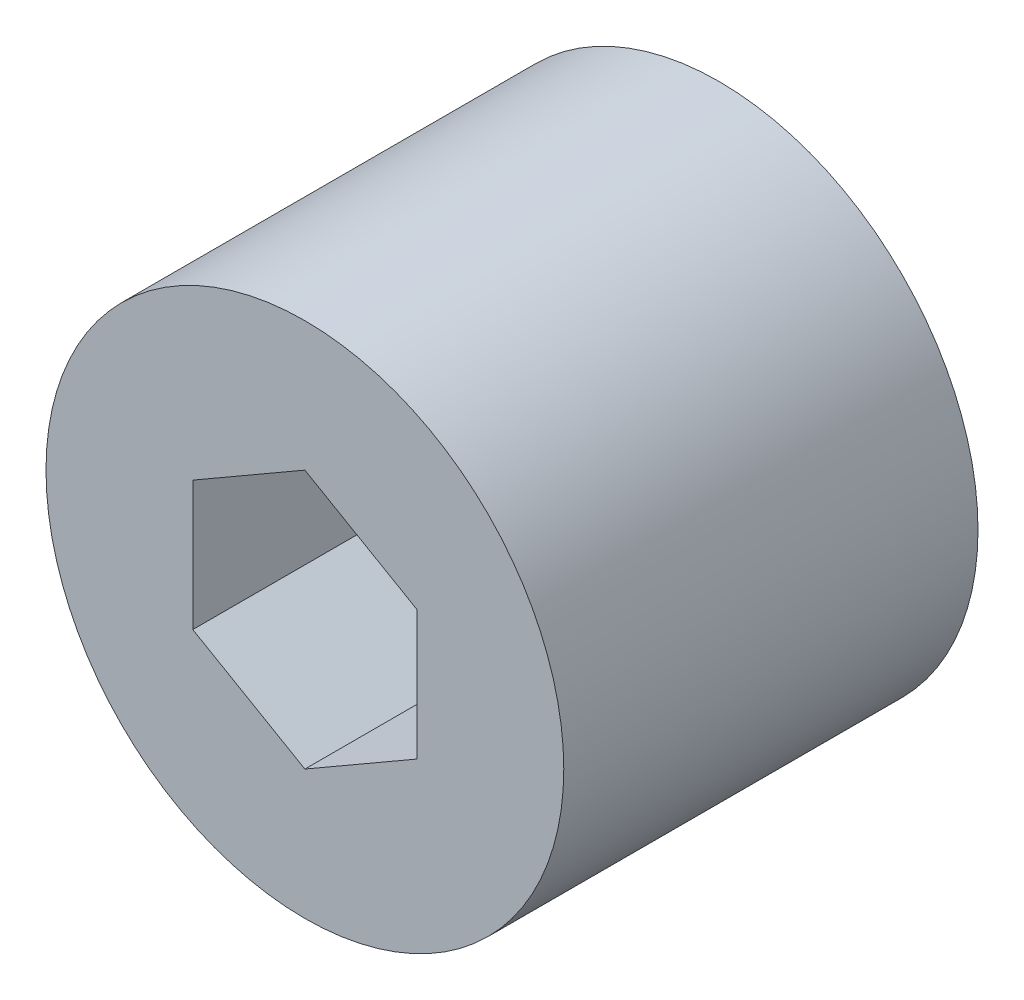
ISO-10303-21;
HEADER;
FILE_DESCRIPTION(('STEP AP214'),'2;1');
FILE_NAME('part.step','',(''),(''),'','','');
FILE_SCHEMA(('AUTOMOTIVE_DESIGN { 1 0 10303 214 1 1 1 1 }'));
ENDSEC;
DATA;
#1=APPLICATION_CONTEXT('core data for automotive mechanical design processes');
#2=APPLICATION_PROTOCOL_DEFINITION('international standard','automotive_design',2000,#1);
#3=PRODUCT_CONTEXT('',#1,'mechanical');
#4=PRODUCT('Part','Part','',(#3));
#5=PRODUCT_RELATED_PRODUCT_CATEGORY('part','',(#4));
#6=PRODUCT_DEFINITION_FORMATION('','',#4);
#7=PRODUCT_DEFINITION_CONTEXT('part definition',#1,'design');
#8=PRODUCT_DEFINITION('design','',#6,#7);
#9=PRODUCT_DEFINITION_SHAPE('','',#8);
#10=(LENGTH_UNIT() NAMED_UNIT(*) SI_UNIT(.MILLI.,.METRE.));
#11=(NAMED_UNIT(*) PLANE_ANGLE_UNIT() SI_UNIT($,.RADIAN.));
#12=(NAMED_UNIT(*) SI_UNIT($,.STERADIAN.) SOLID_ANGLE_UNIT());
#13=UNCERTAINTY_MEASURE_WITH_UNIT(LENGTH_MEASURE(1.E-05),#10,'distance_accuracy_value','');
#14=(GEOMETRIC_REPRESENTATION_CONTEXT(3) GLOBAL_UNCERTAINTY_ASSIGNED_CONTEXT((#13)) GLOBAL_UNIT_ASSIGNED_CONTEXT((#10,
#11,#12)) REPRESENTATION_CONTEXT('',''));
#15=CARTESIAN_POINT('',(0.,0.,0.));
#16=DIRECTION('',(0.,0.,1.));
#17=DIRECTION('',(1.,0.,0.));
#18=AXIS2_PLACEMENT_3D('',#15,#16,#17);
#19=CARTESIAN_POINT('',(-80.1964808393653,-2.97656250000004,19.685));
#20=DIRECTION('',(0.,0.,1.));
#21=DIRECTION('',(1.,0.,0.));
#22=AXIS2_PLACEMENT_3D('',#19,#20,#21);
#23=PLANE('',#22);
#24=DIRECTION('',(-0.86602540378444,-0.499999999999998,0.));
#25=VECTOR('',#24,1.);
#26=CARTESIAN_POINT('',(-81.915,1.98437499999992,19.685));
#27=LINE('',#26,#25);
#28=CARTESIAN_POINT('',(-81.915,1.98437499999991,19.685));
#29=VERTEX_POINT('',#28);
#30=CARTESIAN_POINT('',(-83.6335191606348,0.992187499999908,19.685));
#31=VERTEX_POINT('',#30);
#32=EDGE_CURVE('E89',#29,#31,#27,.T.);
#33=ORIENTED_EDGE('',*,*,#32,.T.);
#34=DIRECTION('',(0.,1.,0.));
#35=VECTOR('',#34,1.);
#36=CARTESIAN_POINT('',(-83.6335191606348,0.992187499999914,19.685));
#37=LINE('',#36,#35);
#38=CARTESIAN_POINT('',(-83.6335191606348,-0.992187500000048,19.685));
#39=VERTEX_POINT('',#38);
#40=EDGE_CURVE('E96',#31,#39,#37,.F.);
#41=ORIENTED_EDGE('',*,*,#40,.T.);
#42=DIRECTION('',(0.86602540378444,-0.499999999999998,0.));
#43=VECTOR('',#42,1.);
#44=CARTESIAN_POINT('',(-83.6335191606348,-0.992187500000048,19.685));
#45=LINE('',#44,#43);
#46=CARTESIAN_POINT('',(-81.915,-1.98437500000007,19.685));
#47=VERTEX_POINT('',#46);
#48=EDGE_CURVE('E101',#39,#47,#45,.T.);
#49=ORIENTED_EDGE('',*,*,#48,.T.);
#50=DIRECTION('',(0.866025403784437,0.500000000000002,0.));
#51=VECTOR('',#50,1.);
#52=CARTESIAN_POINT('',(-81.915,-1.98437500000006,19.685));
#53=LINE('',#52,#51);
#54=CARTESIAN_POINT('',(-80.1964808393653,-0.992187500000062,19.685));
#55=VERTEX_POINT('',#54);
#56=EDGE_CURVE('E72',#47,#55,#53,.T.);
#57=ORIENTED_EDGE('',*,*,#56,.T.);
#58=DIRECTION('',(0.,1.,0.));
#59=VECTOR('',#58,1.);
#60=CARTESIAN_POINT('',(-80.1964808393653,-0.992187500000059,19.685));
#61=LINE('',#60,#59);
#62=CARTESIAN_POINT('',(-80.1964808393653,0.99218749999992,19.685));
#63=VERTEX_POINT('',#62);
#64=EDGE_CURVE('E69',#55,#63,#61,.T.);
#65=ORIENTED_EDGE('',*,*,#64,.T.);
#66=DIRECTION('',(-0.866025403784439,0.499999999999999,0.));
#67=VECTOR('',#66,1.);
#68=CARTESIAN_POINT('',(-80.1964808393653,0.99218749999992,19.685));
#69=LINE('',#68,#67);
#70=EDGE_CURVE('E66',#63,#29,#69,.T.);
#71=ORIENTED_EDGE('',*,*,#70,.T.);
#72=EDGE_LOOP('',(#33,#41,#49,#57,#65,#71));
#73=FACE_BOUND('',#72,.T.);
#74=ADVANCED_FACE('F17',(#73),#23,.T.);
#75=CARTESIAN_POINT('',(-80.1964808393653,-0.992187500000059,19.685));
#76=DIRECTION('',(1.,0.,0.));
#77=DIRECTION('',(0.,0.,-1.));
#78=AXIS2_PLACEMENT_3D('',#75,#76,#77);
#79=PLANE('',#78);
#80=DIRECTION('',(0.,0.,1.));
#81=VECTOR('',#80,1.);
#82=CARTESIAN_POINT('',(-80.1964808393653,0.99218749999992,19.685));
#83=LINE('',#82,#81);
#84=CARTESIAN_POINT('',(-80.1964808393653,0.99218749999992,22.225));
#85=VERTEX_POINT('',#84);
#86=EDGE_CURVE('E75',#85,#63,#83,.F.);
#87=ORIENTED_EDGE('',*,*,#86,.T.);
#88=ORIENTED_EDGE('',*,*,#64,.F.);
#89=DIRECTION('',(0.,0.,1.));
#90=VECTOR('',#89,1.);
#91=CARTESIAN_POINT('',(-80.1964808393653,-0.992187500000072,19.685));
#92=LINE('',#91,#90);
#93=CARTESIAN_POINT('',(-80.1964808393653,-0.992187500000062,22.225));
#94=VERTEX_POINT('',#93);
#95=EDGE_CURVE('E106',#55,#94,#92,.T.);
#96=ORIENTED_EDGE('',*,*,#95,.T.);
#97=DIRECTION('',(0.,1.,0.));
#98=VECTOR('',#97,1.);
#99=CARTESIAN_POINT('',(-80.1964808393653,0.,22.225));
#100=LINE('',#99,#98);
#101=EDGE_CURVE('E80',#94,#85,#100,.T.);
#102=ORIENTED_EDGE('',*,*,#101,.T.);
#103=EDGE_LOOP('',(#87,#88,#96,#102));
#104=FACE_BOUND('',#103,.T.);
#105=ADVANCED_FACE('F78',(#104),#79,.F.);
#106=CARTESIAN_POINT('',(-80.1964808393653,0.99218749999992,19.685));
#107=DIRECTION('',(0.499999999999999,0.866025403784439,0.));
#108=DIRECTION('',(-0.866025403784439,0.499999999999999,0.));
#109=AXIS2_PLACEMENT_3D('',#106,#107,#108);
#110=PLANE('',#109);
#111=DIRECTION('',(0.,0.,1.));
#112=VECTOR('',#111,1.);
#113=CARTESIAN_POINT('',(-81.915,1.98437499999992,19.685));
#114=LINE('',#113,#112);
#115=CARTESIAN_POINT('',(-81.915,1.98437499999991,22.225));
#116=VERTEX_POINT('',#115);
#117=EDGE_CURVE('E86',#116,#29,#114,.F.);
#118=ORIENTED_EDGE('',*,*,#117,.T.);
#119=ORIENTED_EDGE('',*,*,#70,.F.);
#120=ORIENTED_EDGE('',*,*,#86,.F.);
#121=DIRECTION('',(-0.866025403784433,0.50000000000001,0.));
#122=VECTOR('',#121,1.);
#123=CARTESIAN_POINT('',(-80.1964808393653,0.99218749999992,22.225));
#124=LINE('',#123,#122);
#125=EDGE_CURVE('E109',#85,#116,#124,.T.);
#126=ORIENTED_EDGE('',*,*,#125,.T.);
#127=EDGE_LOOP('',(#118,#119,#120,#126));
#128=FACE_BOUND('',#127,.T.);
#129=ADVANCED_FACE('F84',(#128),#110,.F.);
#130=CARTESIAN_POINT('',(-81.915,1.98437499999992,19.685));
#131=DIRECTION('',(-0.499999999999998,0.86602540378444,0.));
#132=DIRECTION('',(-0.86602540378444,-0.499999999999998,0.));
#133=AXIS2_PLACEMENT_3D('',#130,#131,#132);
#134=PLANE('',#133);
#135=DIRECTION('',(0.,0.,1.));
#136=VECTOR('',#135,1.);
#137=CARTESIAN_POINT('',(-83.6335191606348,0.992187499999913,19.685));
#138=LINE('',#137,#136);
#139=CARTESIAN_POINT('',(-83.6335191606348,0.992187499999908,22.225));
#140=VERTEX_POINT('',#139);
#141=EDGE_CURVE('E93',#140,#31,#138,.F.);
#142=ORIENTED_EDGE('',*,*,#141,.T.);
#143=ORIENTED_EDGE('',*,*,#32,.F.);
#144=ORIENTED_EDGE('',*,*,#117,.F.);
#145=DIRECTION('',(-0.866025403784444,-0.499999999999991,0.));
#146=VECTOR('',#145,1.);
#147=CARTESIAN_POINT('',(-81.915,1.98437499999992,22.225));
#148=LINE('',#147,#146);
#149=EDGE_CURVE('E111',#116,#140,#148,.T.);
#150=ORIENTED_EDGE('',*,*,#149,.T.);
#151=EDGE_LOOP('',(#142,#143,#144,#150));
#152=FACE_BOUND('',#151,.T.);
#153=ADVANCED_FACE('F183',(#152),#134,.F.);
#154=CARTESIAN_POINT('',(-83.6335191606348,0.992187499999914,19.685));
#155=DIRECTION('',(-1.,0.,0.));
#156=DIRECTION('',(0.,0.,1.));
#157=AXIS2_PLACEMENT_3D('',#154,#155,#156);
#158=PLANE('',#157);
#159=DIRECTION('',(0.,0.,1.));
#160=VECTOR('',#159,1.);
#161=CARTESIAN_POINT('',(-83.6335191606348,-0.992187500000048,19.685));
#162=LINE('',#161,#160);
#163=CARTESIAN_POINT('',(-83.6335191606348,-0.992187500000048,22.225));
#164=VERTEX_POINT('',#163);
#165=EDGE_CURVE('E98',#164,#39,#162,.F.);
#166=ORIENTED_EDGE('',*,*,#165,.T.);
#167=ORIENTED_EDGE('',*,*,#40,.F.);
#168=ORIENTED_EDGE('',*,*,#141,.F.);
#169=DIRECTION('',(0.,1.,0.));
#170=VECTOR('',#169,1.);
#171=CARTESIAN_POINT('',(-83.6335191606348,0.,22.225));
#172=LINE('',#171,#170);
#173=EDGE_CURVE('E113',#140,#164,#172,.F.);
#174=ORIENTED_EDGE('',*,*,#173,.T.);
#175=EDGE_LOOP('',(#166,#167,#168,#174));
#176=FACE_BOUND('',#175,.T.);
#177=ADVANCED_FACE('F174',(#176),#158,.F.);
#178=CARTESIAN_POINT('',(-83.6335191606348,-0.992187500000048,19.685));
#179=DIRECTION('',(-0.499999999999998,-0.86602540378444,0.));
#180=DIRECTION('',(0.86602540378444,-0.499999999999998,0.));
#181=AXIS2_PLACEMENT_3D('',#178,#179,#180);
#182=PLANE('',#181);
#183=DIRECTION('',(0.,0.,1.));
#184=VECTOR('',#183,1.);
#185=CARTESIAN_POINT('',(-81.915,-1.98437500000006,19.685));
#186=LINE('',#185,#184);
#187=CARTESIAN_POINT('',(-81.915,-1.98437500000007,22.225));
#188=VERTEX_POINT('',#187);
#189=EDGE_CURVE('E103',#188,#47,#186,.F.);
#190=ORIENTED_EDGE('',*,*,#189,.T.);
#191=ORIENTED_EDGE('',*,*,#48,.F.);
#192=ORIENTED_EDGE('',*,*,#165,.F.);
#193=DIRECTION('',(0.866025403784443,-0.499999999999993,0.));
#194=VECTOR('',#193,1.);
#195=CARTESIAN_POINT('',(-83.6335191606348,-0.992187500000048,22.225));
#196=LINE('',#195,#194);
#197=EDGE_CURVE('E33',#164,#188,#196,.T.);
#198=ORIENTED_EDGE('',*,*,#197,.T.);
#199=EDGE_LOOP('',(#190,#191,#192,#198));
#200=FACE_BOUND('',#199,.T.);
#201=ADVANCED_FACE('F137',(#200),#182,.F.);
#202=CARTESIAN_POINT('',(-81.915,-1.98437500000006,19.685));
#203=DIRECTION('',(0.500000000000002,-0.866025403784437,0.));
#204=DIRECTION('',(0.866025403784437,0.500000000000002,0.));
#205=AXIS2_PLACEMENT_3D('',#202,#203,#204);
#206=PLANE('',#205);
#207=ORIENTED_EDGE('',*,*,#95,.F.);
#208=ORIENTED_EDGE('',*,*,#56,.F.);
#209=ORIENTED_EDGE('',*,*,#189,.F.);
#210=DIRECTION('',(0.866025403784433,0.50000000000001,0.));
#211=VECTOR('',#210,1.);
#212=CARTESIAN_POINT('',(-81.915,-1.98437500000006,22.225));
#213=LINE('',#212,#211);
#214=EDGE_CURVE('E116',#188,#94,#213,.T.);
#215=ORIENTED_EDGE('',*,*,#214,.T.);
#216=EDGE_LOOP('',(#207,#208,#209,#215));
#217=FACE_BOUND('',#216,.T.);
#218=ADVANCED_FACE('F128',(#217),#206,.F.);
#219=CARTESIAN_POINT('',(-81.915,0.,15.875));
#220=DIRECTION('',(0.,0.,1.));
#221=DIRECTION('',(0.,-1.,0.));
#222=AXIS2_PLACEMENT_3D('',#219,#220,#221);
#223=PLANE('',#222);
#224=CARTESIAN_POINT('',(-81.915,0.,15.875));
#225=DIRECTION('',(0.,0.,1.));
#226=DIRECTION('',(0.,-1.,0.));
#227=AXIS2_PLACEMENT_3D('',#224,#225,#226);
#228=CIRCLE('',#227,3.96875);
#229=CARTESIAN_POINT('',(-81.915,-3.96875000000005,15.875));
#230=VERTEX_POINT('',#229);
#231=EDGE_CURVE('E20',#230,#230,#228,.T.);
#232=ORIENTED_EDGE('',*,*,#231,.F.);
#233=EDGE_LOOP('',(#232));
#234=FACE_BOUND('',#233,.T.);
#235=ADVANCED_FACE('F125',(#234),#223,.F.);
#236=CARTESIAN_POINT('',(-81.915,0.,22.225));
#237=DIRECTION('',(0.,0.,-1.));
#238=DIRECTION('',(0.,1.,0.));
#239=AXIS2_PLACEMENT_3D('',#236,#237,#238);
#240=PLANE('',#239);
#241=ORIENTED_EDGE('',*,*,#197,.F.);
#242=ORIENTED_EDGE('',*,*,#173,.F.);
#243=ORIENTED_EDGE('',*,*,#149,.F.);
#244=ORIENTED_EDGE('',*,*,#125,.F.);
#245=ORIENTED_EDGE('',*,*,#101,.F.);
#246=ORIENTED_EDGE('',*,*,#214,.F.);
#247=EDGE_LOOP('',(#241,#242,#243,#244,#245,#246));
#248=FACE_BOUND('',#247,.T.);
#249=CARTESIAN_POINT('',(-81.915,0.,22.225));
#250=DIRECTION('',(0.,0.,1.));
#251=DIRECTION('',(0.,-1.,0.));
#252=AXIS2_PLACEMENT_3D('',#249,#250,#251);
#253=CIRCLE('',#252,3.96875);
#254=CARTESIAN_POINT('',(-81.915,-3.96875000000008,22.225));
#255=VERTEX_POINT('',#254);
#256=EDGE_CURVE('E11',#255,#255,#253,.F.);
#257=ORIENTED_EDGE('',*,*,#256,.F.);
#258=EDGE_LOOP('',(#257));
#259=FACE_BOUND('',#258,.T.);
#260=ADVANCED_FACE('F127',(#248,#259),#240,.F.);
#261=CARTESIAN_POINT('',(-81.915,0.,22.225));
#262=DIRECTION('',(0.,0.,1.));
#263=DIRECTION('',(0.,-1.,0.));
#264=AXIS2_PLACEMENT_3D('',#261,#262,#263);
#265=CYLINDRICAL_SURFACE('',#264,3.96875);
#266=ORIENTED_EDGE('',*,*,#256,.T.);
#267=EDGE_LOOP('',(#266));
#268=FACE_BOUND('',#267,.T.);
#269=ORIENTED_EDGE('',*,*,#231,.T.);
#270=EDGE_LOOP('',(#269));
#271=FACE_BOUND('',#270,.T.);
#272=ADVANCED_FACE('F123',(#268,#271),#265,.T.);
#273=CLOSED_SHELL('',(#74,#105,#129,#153,#177,#201,#218,#235,#260,#272));
#274=MANIFOLD_SOLID_BREP('B1',#273);
#275=ADVANCED_BREP_SHAPE_REPRESENTATION('',(#18,#274),#14);
#276=SHAPE_DEFINITION_REPRESENTATION(#9,#275);
ENDSEC;
END-ISO-10303-21;
